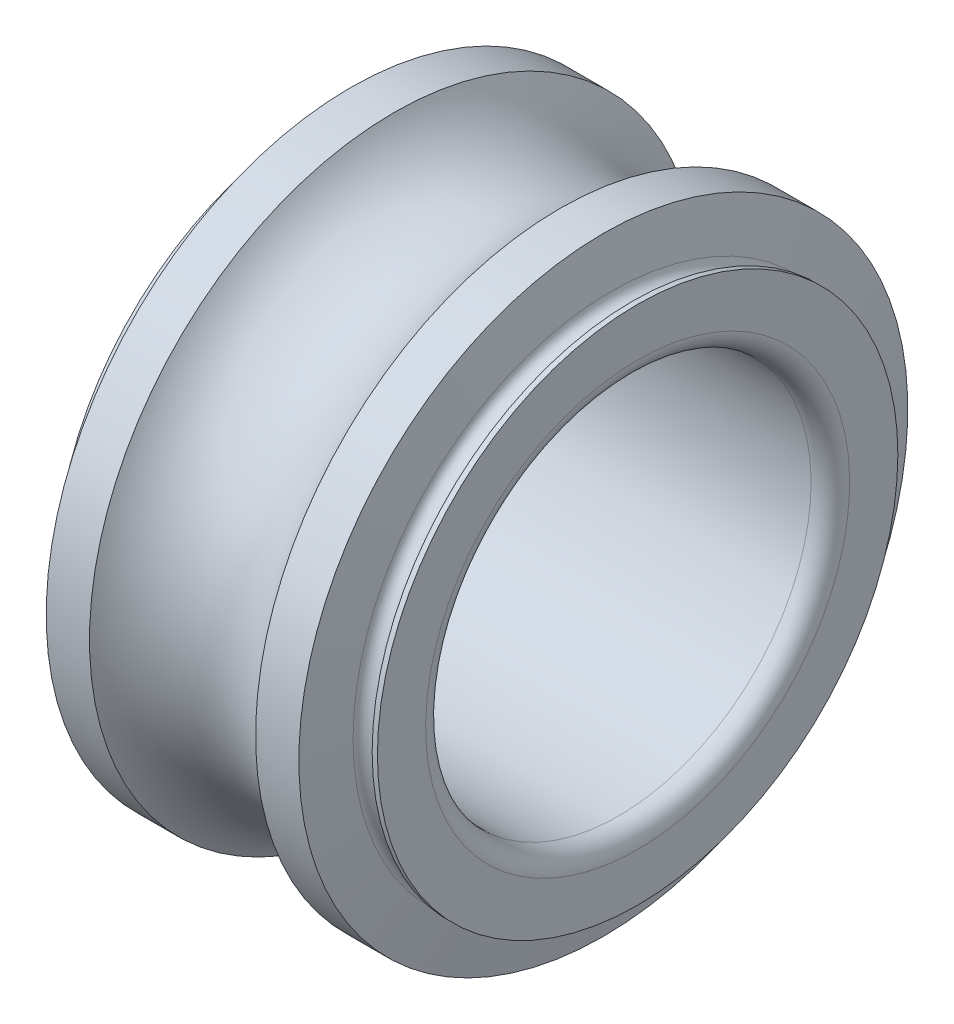
ISO-10303-21;
HEADER;
FILE_DESCRIPTION(('STEP AP214'),'2;1');
FILE_NAME('part.step','',(''),(''),'','','');
FILE_SCHEMA(('AUTOMOTIVE_DESIGN { 1 0 10303 214 1 1 1 1 }'));
ENDSEC;
DATA;
#1=APPLICATION_CONTEXT('core data for automotive mechanical design processes');
#2=APPLICATION_PROTOCOL_DEFINITION('international standard','automotive_design',2000,#1);
#3=PRODUCT_CONTEXT('',#1,'mechanical');
#4=PRODUCT('Part','Part','',(#3));
#5=PRODUCT_RELATED_PRODUCT_CATEGORY('part','',(#4));
#6=PRODUCT_DEFINITION_FORMATION('','',#4);
#7=PRODUCT_DEFINITION_CONTEXT('part definition',#1,'design');
#8=PRODUCT_DEFINITION('design','',#6,#7);
#9=PRODUCT_DEFINITION_SHAPE('','',#8);
#10=(LENGTH_UNIT() NAMED_UNIT(*) SI_UNIT(.MILLI.,.METRE.));
#11=(NAMED_UNIT(*) PLANE_ANGLE_UNIT() SI_UNIT($,.RADIAN.));
#12=(NAMED_UNIT(*) SI_UNIT($,.STERADIAN.) SOLID_ANGLE_UNIT());
#13=UNCERTAINTY_MEASURE_WITH_UNIT(LENGTH_MEASURE(1.E-05),#10,'distance_accuracy_value','');
#14=(GEOMETRIC_REPRESENTATION_CONTEXT(3) GLOBAL_UNCERTAINTY_ASSIGNED_CONTEXT((#13)) GLOBAL_UNIT_ASSIGNED_CONTEXT((#10,
#11,#12)) REPRESENTATION_CONTEXT('',''));
#15=CARTESIAN_POINT('',(0.,0.,0.));
#16=DIRECTION('',(0.,0.,1.));
#17=DIRECTION('',(1.,0.,0.));
#18=AXIS2_PLACEMENT_3D('',#15,#16,#17);
#19=CARTESIAN_POINT('',(8.25839926580473,0.,0.));
#20=DIRECTION('',(-1.,0.,0.));
#21=DIRECTION('',(0.,1.,0.));
#22=AXIS2_PLACEMENT_3D('',#19,#20,#21);
#23=CYLINDRICAL_SURFACE('',#22,9.477);
#24=CARTESIAN_POINT('',(7.58466071274355,0.,0.));
#25=DIRECTION('',(1.,0.,0.));
#26=DIRECTION('',(0.,1.,0.));
#27=AXIS2_PLACEMENT_3D('',#24,#25,#26);
#28=CIRCLE('',#27,9.477);
#29=CARTESIAN_POINT('',(7.58466071274355,9.477,0.));
#30=VERTEX_POINT('',#29);
#31=EDGE_CURVE('E11',#30,#30,#28,.T.);
#32=ORIENTED_EDGE('',*,*,#31,.T.);
#33=EDGE_LOOP('',(#32));
#34=FACE_BOUND('',#33,.T.);
#35=CARTESIAN_POINT('',(8.93213781886592,0.,0.));
#36=DIRECTION('',(1.,0.,0.));
#37=DIRECTION('',(0.,1.,0.));
#38=AXIS2_PLACEMENT_3D('',#35,#36,#37);
#39=CIRCLE('',#38,9.477);
#40=CARTESIAN_POINT('',(8.93213781886592,9.477,0.));
#41=VERTEX_POINT('',#40);
#42=EDGE_CURVE('E80',#41,#41,#39,.T.);
#43=ORIENTED_EDGE('',*,*,#42,.F.);
#44=EDGE_LOOP('',(#43));
#45=FACE_BOUND('',#44,.T.);
#46=ADVANCED_FACE('F17',(#34,#45),#23,.T.);
#47=CARTESIAN_POINT('',(5.,0.,0.));
#48=DIRECTION('',(1.,0.,0.));
#49=DIRECTION('',(0.,0.,-1.));
#50=AXIS2_PLACEMENT_3D('',#47,#48,#49);
#51=TOROIDAL_SURFACE('',#50,11.,3.);
#52=CARTESIAN_POINT('',(2.41533928725645,0.,0.));
#53=DIRECTION('',(1.,0.,0.));
#54=DIRECTION('',(0.,1.,0.));
#55=AXIS2_PLACEMENT_3D('',#52,#53,#54);
#56=CIRCLE('',#55,9.477);
#57=CARTESIAN_POINT('',(2.41533928725645,9.477,0.));
#58=VERTEX_POINT('',#57);
#59=EDGE_CURVE('E27',#58,#58,#56,.T.);
#60=ORIENTED_EDGE('',*,*,#59,.T.);
#61=EDGE_LOOP('',(#60));
#62=FACE_BOUND('',#61,.T.);
#63=ORIENTED_EDGE('',*,*,#31,.F.);
#64=EDGE_LOOP('',(#63));
#65=FACE_BOUND('',#64,.T.);
#66=ADVANCED_FACE('F126',(#62,#65),#51,.F.);
#67=CARTESIAN_POINT('',(1.74160073419527,0.,0.));
#68=DIRECTION('',(-1.,0.,0.));
#69=DIRECTION('',(0.,1.,0.));
#70=AXIS2_PLACEMENT_3D('',#67,#68,#69);
#71=CYLINDRICAL_SURFACE('',#70,9.477);
#72=CARTESIAN_POINT('',(1.06786218113408,0.,0.));
#73=DIRECTION('',(1.,0.,0.));
#74=DIRECTION('',(0.,1.,0.));
#75=AXIS2_PLACEMENT_3D('',#72,#73,#74);
#76=CIRCLE('',#75,9.477);
#77=CARTESIAN_POINT('',(1.06786218113408,9.477,0.));
#78=VERTEX_POINT('',#77);
#79=EDGE_CURVE('E93',#78,#78,#76,.T.);
#80=ORIENTED_EDGE('',*,*,#79,.T.);
#81=EDGE_LOOP('',(#80));
#82=FACE_BOUND('',#81,.T.);
#83=ORIENTED_EDGE('',*,*,#59,.F.);
#84=EDGE_LOOP('',(#83));
#85=FACE_BOUND('',#84,.T.);
#86=ADVANCED_FACE('F131',(#82,#85),#71,.T.);
#87=CARTESIAN_POINT('',(0.941439562061043,0.,0.));
#88=DIRECTION('',(1.,0.,0.));
#89=DIRECTION('',(0.,1.,0.));
#90=AXIS2_PLACEMENT_3D('',#87,#88,#89);
#91=CONICAL_SURFACE('',#90,8.76002169886262,1.39626340159546);
#92=CARTESIAN_POINT('',(0.815016942988004,0.,0.));
#93=DIRECTION('',(1.,0.,0.));
#94=DIRECTION('',(0.,1.,0.));
#95=AXIS2_PLACEMENT_3D('',#92,#93,#94);
#96=CIRCLE('',#95,8.04304339772525);
#97=CARTESIAN_POINT('',(0.815016942988004,8.04304339772525,0.));
#98=VERTEX_POINT('',#97);
#99=EDGE_CURVE('E92',#98,#98,#96,.T.);
#100=ORIENTED_EDGE('',*,*,#99,.T.);
#101=EDGE_LOOP('',(#100));
#102=FACE_BOUND('',#101,.T.);
#103=ORIENTED_EDGE('',*,*,#79,.F.);
#104=EDGE_LOOP('',(#103));
#105=FACE_BOUND('',#104,.T.);
#106=ADVANCED_FACE('F165',(#102,#105),#91,.T.);
#107=CARTESIAN_POINT('',(0.492,0.,0.));
#108=DIRECTION('',(1.,0.,0.));
#109=DIRECTION('',(0.,0.,-1.));
#110=AXIS2_PLACEMENT_3D('',#107,#108,#109);
#111=TOROIDAL_SURFACE('',#110,8.1,0.328);
#112=CARTESIAN_POINT('',(0.164,0.,0.));
#113=DIRECTION('',(1.,0.,0.));
#114=DIRECTION('',(0.,1.,0.));
#115=AXIS2_PLACEMENT_3D('',#112,#113,#114);
#116=CIRCLE('',#115,8.1);
#117=CARTESIAN_POINT('',(0.164,8.1,0.));
#118=VERTEX_POINT('',#117);
#119=EDGE_CURVE('E90',#118,#118,#116,.T.);
#120=ORIENTED_EDGE('',*,*,#119,.T.);
#121=EDGE_LOOP('',(#120));
#122=FACE_BOUND('',#121,.T.);
#123=ORIENTED_EDGE('',*,*,#99,.F.);
#124=EDGE_LOOP('',(#123));
#125=FACE_BOUND('',#124,.T.);
#126=ADVANCED_FACE('F19',(#122,#125),#111,.F.);
#127=CARTESIAN_POINT('',(0.082,0.,0.));
#128=DIRECTION('',(-1.,0.,0.));
#129=DIRECTION('',(0.,1.,0.));
#130=AXIS2_PLACEMENT_3D('',#127,#128,#129);
#131=CYLINDRICAL_SURFACE('',#130,8.1);
#132=CARTESIAN_POINT('',(0.,0.,0.));
#133=DIRECTION('',(1.,0.,0.));
#134=DIRECTION('',(0.,1.,0.));
#135=AXIS2_PLACEMENT_3D('',#132,#133,#134);
#136=CIRCLE('',#135,8.1);
#137=CARTESIAN_POINT('',(0.,8.1,0.));
#138=VERTEX_POINT('',#137);
#139=EDGE_CURVE('E46',#138,#138,#136,.T.);
#140=ORIENTED_EDGE('',*,*,#139,.T.);
#141=EDGE_LOOP('',(#140));
#142=FACE_BOUND('',#141,.T.);
#143=ORIENTED_EDGE('',*,*,#119,.F.);
#144=EDGE_LOOP('',(#143));
#145=FACE_BOUND('',#144,.T.);
#146=ADVANCED_FACE('F137',(#142,#145),#131,.T.);
#147=CARTESIAN_POINT('',(0.,7.35,0.));
#148=DIRECTION('',(-1.,0.,0.));
#149=DIRECTION('',(0.,-1.,0.));
#150=AXIS2_PLACEMENT_3D('',#147,#148,#149);
#151=PLANE('',#150);
#152=CARTESIAN_POINT('',(0.,0.,0.));
#153=DIRECTION('',(1.,0.,0.));
#154=DIRECTION('',(0.,1.,0.));
#155=AXIS2_PLACEMENT_3D('',#152,#153,#154);
#156=CIRCLE('',#155,6.6);
#157=CARTESIAN_POINT('',(0.,6.6,0.));
#158=VERTEX_POINT('',#157);
#159=EDGE_CURVE('E53',#158,#158,#156,.T.);
#160=ORIENTED_EDGE('',*,*,#159,.T.);
#161=EDGE_LOOP('',(#160));
#162=FACE_BOUND('',#161,.T.);
#163=ORIENTED_EDGE('',*,*,#139,.F.);
#164=EDGE_LOOP('',(#163));
#165=FACE_BOUND('',#164,.T.);
#166=ADVANCED_FACE('F123',(#162,#165),#151,.T.);
#167=CARTESIAN_POINT('',(0.6,0.,0.));
#168=DIRECTION('',(1.,0.,0.));
#169=DIRECTION('',(0.,0.,-1.));
#170=AXIS2_PLACEMENT_3D('',#167,#168,#169);
#171=TOROIDAL_SURFACE('',#170,6.6,0.6);
#172=CARTESIAN_POINT('',(0.6,0.,0.));
#173=DIRECTION('',(1.,0.,0.));
#174=DIRECTION('',(0.,1.,0.));
#175=AXIS2_PLACEMENT_3D('',#172,#173,#174);
#176=CIRCLE('',#175,6.);
#177=CARTESIAN_POINT('',(0.6,6.,0.));
#178=VERTEX_POINT('',#177);
#179=EDGE_CURVE('E21',#178,#178,#176,.T.);
#180=ORIENTED_EDGE('',*,*,#179,.T.);
#181=EDGE_LOOP('',(#180));
#182=FACE_BOUND('',#181,.T.);
#183=ORIENTED_EDGE('',*,*,#159,.F.);
#184=EDGE_LOOP('',(#183));
#185=FACE_BOUND('',#184,.T.);
#186=ADVANCED_FACE('F109',(#182,#185),#171,.T.);
#187=CARTESIAN_POINT('',(5.,0.,0.));
#188=DIRECTION('',(-1.,0.,0.));
#189=DIRECTION('',(0.,1.,0.));
#190=AXIS2_PLACEMENT_3D('',#187,#188,#189);
#191=CYLINDRICAL_SURFACE('',#190,6.);
#192=CARTESIAN_POINT('',(9.4,0.,0.));
#193=DIRECTION('',(1.,0.,0.));
#194=DIRECTION('',(0.,1.,0.));
#195=AXIS2_PLACEMENT_3D('',#192,#193,#194);
#196=CIRCLE('',#195,6.);
#197=CARTESIAN_POINT('',(9.4,6.,0.));
#198=VERTEX_POINT('',#197);
#199=EDGE_CURVE('E102',#198,#198,#196,.T.);
#200=ORIENTED_EDGE('',*,*,#199,.T.);
#201=EDGE_LOOP('',(#200));
#202=FACE_BOUND('',#201,.T.);
#203=ORIENTED_EDGE('',*,*,#179,.F.);
#204=EDGE_LOOP('',(#203));
#205=FACE_BOUND('',#204,.T.);
#206=ADVANCED_FACE('F112',(#202,#205),#191,.F.);
#207=CARTESIAN_POINT('',(9.4,0.,0.));
#208=DIRECTION('',(1.,0.,0.));
#209=DIRECTION('',(0.,0.,-1.));
#210=AXIS2_PLACEMENT_3D('',#207,#208,#209);
#211=TOROIDAL_SURFACE('',#210,6.6,0.6);
#212=CARTESIAN_POINT('',(10.,0.,0.));
#213=DIRECTION('',(1.,0.,0.));
#214=DIRECTION('',(0.,1.,0.));
#215=AXIS2_PLACEMENT_3D('',#212,#213,#214);
#216=CIRCLE('',#215,6.6);
#217=CARTESIAN_POINT('',(10.,6.6,0.));
#218=VERTEX_POINT('',#217);
#219=EDGE_CURVE('E82',#218,#218,#216,.T.);
#220=ORIENTED_EDGE('',*,*,#219,.T.);
#221=EDGE_LOOP('',(#220));
#222=FACE_BOUND('',#221,.T.);
#223=ORIENTED_EDGE('',*,*,#199,.F.);
#224=EDGE_LOOP('',(#223));
#225=FACE_BOUND('',#224,.T.);
#226=ADVANCED_FACE('F114',(#222,#225),#211,.T.);
#227=CARTESIAN_POINT('',(10.,7.35,0.));
#228=DIRECTION('',(1.,0.,0.));
#229=DIRECTION('',(0.,1.,0.));
#230=AXIS2_PLACEMENT_3D('',#227,#228,#229);
#231=PLANE('',#230);
#232=CARTESIAN_POINT('',(10.,0.,0.));
#233=DIRECTION('',(1.,0.,0.));
#234=DIRECTION('',(0.,1.,0.));
#235=AXIS2_PLACEMENT_3D('',#232,#233,#234);
#236=CIRCLE('',#235,8.1);
#237=CARTESIAN_POINT('',(10.,8.1,0.));
#238=VERTEX_POINT('',#237);
#239=EDGE_CURVE('E79',#238,#238,#236,.T.);
#240=ORIENTED_EDGE('',*,*,#239,.T.);
#241=EDGE_LOOP('',(#240));
#242=FACE_BOUND('',#241,.T.);
#243=ORIENTED_EDGE('',*,*,#219,.F.);
#244=EDGE_LOOP('',(#243));
#245=FACE_BOUND('',#244,.T.);
#246=ADVANCED_FACE('F121',(#242,#245),#231,.T.);
#247=CARTESIAN_POINT('',(9.918,0.,0.));
#248=DIRECTION('',(-1.,0.,0.));
#249=DIRECTION('',(0.,1.,0.));
#250=AXIS2_PLACEMENT_3D('',#247,#248,#249);
#251=CYLINDRICAL_SURFACE('',#250,8.1);
#252=CARTESIAN_POINT('',(9.836,0.,0.));
#253=DIRECTION('',(1.,0.,0.));
#254=DIRECTION('',(0.,1.,0.));
#255=AXIS2_PLACEMENT_3D('',#252,#253,#254);
#256=CIRCLE('',#255,8.1);
#257=CARTESIAN_POINT('',(9.836,8.1,0.));
#258=VERTEX_POINT('',#257);
#259=EDGE_CURVE('E75',#258,#258,#256,.T.);
#260=ORIENTED_EDGE('',*,*,#259,.T.);
#261=EDGE_LOOP('',(#260));
#262=FACE_BOUND('',#261,.T.);
#263=ORIENTED_EDGE('',*,*,#239,.F.);
#264=EDGE_LOOP('',(#263));
#265=FACE_BOUND('',#264,.T.);
#266=ADVANCED_FACE('F76',(#262,#265),#251,.T.);
#267=CARTESIAN_POINT('',(9.508,0.,0.));
#268=DIRECTION('',(1.,0.,0.));
#269=DIRECTION('',(0.,0.,-1.));
#270=AXIS2_PLACEMENT_3D('',#267,#268,#269);
#271=TOROIDAL_SURFACE('',#270,8.1,0.328);
#272=CARTESIAN_POINT('',(9.18498305701199,0.,0.));
#273=DIRECTION('',(1.,0.,0.));
#274=DIRECTION('',(0.,1.,0.));
#275=AXIS2_PLACEMENT_3D('',#272,#273,#274);
#276=CIRCLE('',#275,8.04304339772525);
#277=CARTESIAN_POINT('',(9.18498305701199,8.04304339772525,0.));
#278=VERTEX_POINT('',#277);
#279=EDGE_CURVE('E84',#278,#278,#276,.T.);
#280=ORIENTED_EDGE('',*,*,#279,.T.);
#281=EDGE_LOOP('',(#280));
#282=FACE_BOUND('',#281,.T.);
#283=ORIENTED_EDGE('',*,*,#259,.F.);
#284=EDGE_LOOP('',(#283));
#285=FACE_BOUND('',#284,.T.);
#286=ADVANCED_FACE('F142',(#282,#285),#271,.F.);
#287=CARTESIAN_POINT('',(9.05856043793896,0.,0.));
#288=DIRECTION('',(-1.,0.,0.));
#289=DIRECTION('',(0.,1.,0.));
#290=AXIS2_PLACEMENT_3D('',#287,#288,#289);
#291=CONICAL_SURFACE('',#290,8.76002169886262,1.39626340159546);
#292=ORIENTED_EDGE('',*,*,#42,.T.);
#293=EDGE_LOOP('',(#292));
#294=FACE_BOUND('',#293,.T.);
#295=ORIENTED_EDGE('',*,*,#279,.F.);
#296=EDGE_LOOP('',(#295));
#297=FACE_BOUND('',#296,.T.);
#298=ADVANCED_FACE('F140',(#294,#297),#291,.T.);
#299=CLOSED_SHELL('',(#46,#66,#86,#106,#126,#146,#166,#186,#206,#226,#246,#266,#286,#298));
#300=MANIFOLD_SOLID_BREP('B1',#299);
#301=ADVANCED_BREP_SHAPE_REPRESENTATION('',(#18,#300),#14);
#302=SHAPE_DEFINITION_REPRESENTATION(#9,#301);
ENDSEC;
END-ISO-10303-21;
